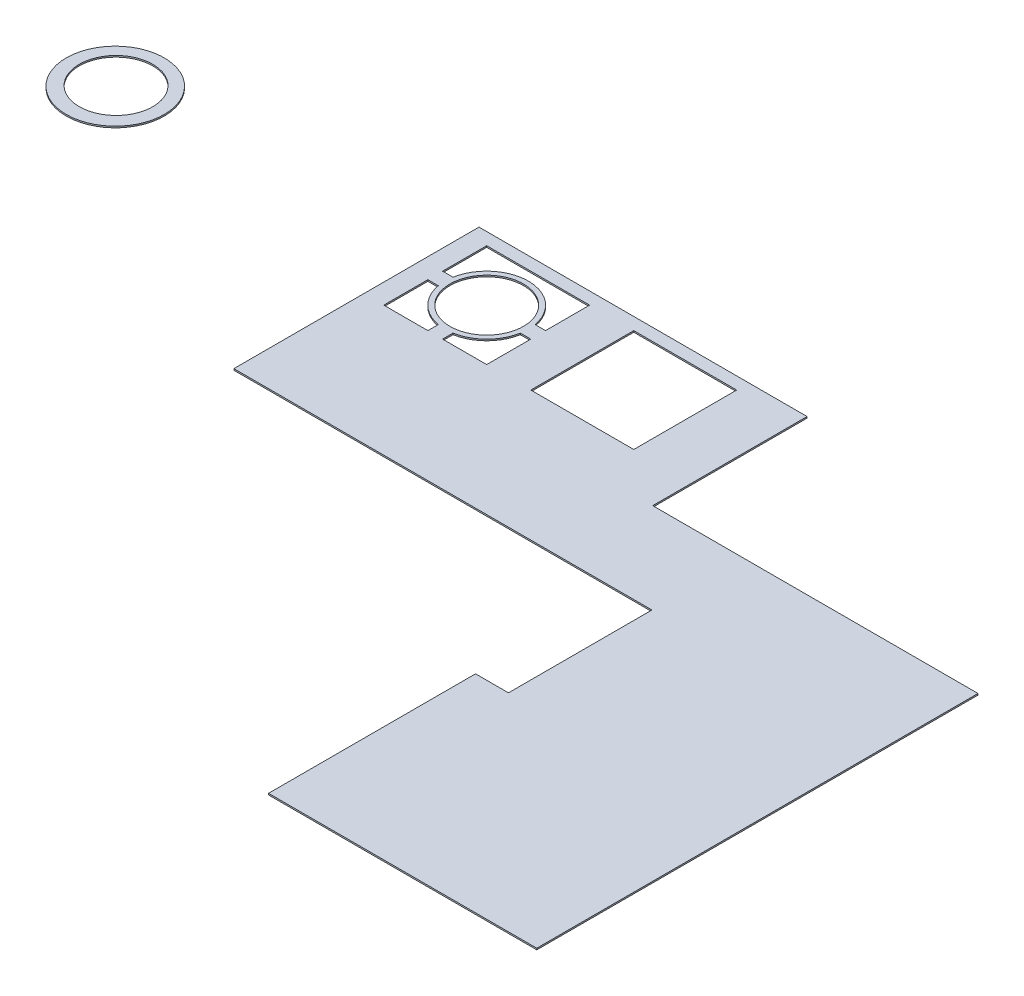
ISO-10303-21;
HEADER;
FILE_DESCRIPTION(('STEP AP214'),'2;1');
FILE_NAME('part.step','',(''),(''),'','','');
FILE_SCHEMA(('AUTOMOTIVE_DESIGN { 1 0 10303 214 1 1 1 1 }'));
ENDSEC;
DATA;
#1=APPLICATION_CONTEXT('core data for automotive mechanical design processes');
#2=APPLICATION_PROTOCOL_DEFINITION('international standard','automotive_design',2000,#1);
#3=PRODUCT_CONTEXT('',#1,'mechanical');
#4=PRODUCT('Part','Part','',(#3));
#5=PRODUCT_RELATED_PRODUCT_CATEGORY('part','',(#4));
#6=PRODUCT_DEFINITION_FORMATION('','',#4);
#7=PRODUCT_DEFINITION_CONTEXT('part definition',#1,'design');
#8=PRODUCT_DEFINITION('design','',#6,#7);
#9=PRODUCT_DEFINITION_SHAPE('','',#8);
#10=(LENGTH_UNIT() NAMED_UNIT(*) SI_UNIT(.MILLI.,.METRE.));
#11=(NAMED_UNIT(*) PLANE_ANGLE_UNIT() SI_UNIT($,.RADIAN.));
#12=(NAMED_UNIT(*) SI_UNIT($,.STERADIAN.) SOLID_ANGLE_UNIT());
#13=UNCERTAINTY_MEASURE_WITH_UNIT(LENGTH_MEASURE(1.E-05),#10,'distance_accuracy_value','');
#14=(GEOMETRIC_REPRESENTATION_CONTEXT(3) GLOBAL_UNCERTAINTY_ASSIGNED_CONTEXT((#13)) GLOBAL_UNIT_ASSIGNED_CONTEXT((#10,
#11,#12)) REPRESENTATION_CONTEXT('',''));
#15=CARTESIAN_POINT('',(0.,0.,0.));
#16=DIRECTION('',(0.,0.,1.));
#17=DIRECTION('',(1.,0.,0.));
#18=AXIS2_PLACEMENT_3D('',#15,#16,#17);
#19=CARTESIAN_POINT('',(-6.2,0.,-3.78));
#20=DIRECTION('',(0.,1.,0.));
#21=DIRECTION('',(0.,0.,1.));
#22=AXIS2_PLACEMENT_3D('',#19,#20,#21);
#23=CYLINDRICAL_SURFACE('',#22,1.);
#24=CARTESIAN_POINT('',(-6.2,0.,-3.78));
#25=DIRECTION('',(0.,1.,0.));
#26=DIRECTION('',(0.,0.,1.));
#27=AXIS2_PLACEMENT_3D('',#24,#25,#26);
#28=CIRCLE('',#27,1.);
#29=CARTESIAN_POINT('',(-6.2,0.,-2.78));
#30=VERTEX_POINT('',#29);
#31=EDGE_CURVE('E11',#30,#30,#28,.T.);
#32=ORIENTED_EDGE('',*,*,#31,.T.);
#33=EDGE_LOOP('',(#32));
#34=FACE_BOUND('',#33,.T.);
#35=CARTESIAN_POINT('',(-6.2,0.03,-3.78));
#36=DIRECTION('',(0.,1.,0.));
#37=DIRECTION('',(0.,0.,1.));
#38=AXIS2_PLACEMENT_3D('',#35,#36,#37);
#39=CIRCLE('',#38,1.);
#40=CARTESIAN_POINT('',(-6.2,0.03,-2.78));
#41=VERTEX_POINT('',#40);
#42=EDGE_CURVE('E54',#41,#41,#39,.T.);
#43=ORIENTED_EDGE('',*,*,#42,.F.);
#44=EDGE_LOOP('',(#43));
#45=FACE_BOUND('',#44,.T.);
#46=ADVANCED_FACE('F51',(#34,#45),#23,.T.);
#47=CARTESIAN_POINT('',(-6.2,0.,-3.78));
#48=DIRECTION('',(0.,1.,0.));
#49=DIRECTION('',(0.,0.,1.));
#50=AXIS2_PLACEMENT_3D('',#47,#48,#49);
#51=PLANE('',#50);
#52=CARTESIAN_POINT('',(-6.204,0.,-3.80000000000001));
#53=DIRECTION('',(0.,1.,0.));
#54=DIRECTION('',(0.,0.,1.));
#55=AXIS2_PLACEMENT_3D('',#52,#53,#54);
#56=CIRCLE('',#55,0.750000000000001);
#57=CARTESIAN_POINT('',(-6.204,0.,-3.05000000000001));
#58=VERTEX_POINT('',#57);
#59=EDGE_CURVE('E61',#58,#58,#56,.T.);
#60=ORIENTED_EDGE('',*,*,#59,.T.);
#61=EDGE_LOOP('',(#60));
#62=FACE_BOUND('',#61,.T.);
#63=ORIENTED_EDGE('',*,*,#31,.F.);
#64=EDGE_LOOP('',(#63));
#65=FACE_BOUND('',#64,.T.);
#66=ADVANCED_FACE('F69',(#62,#65),#51,.F.);
#67=CARTESIAN_POINT('',(-6.2,0.03,-3.78));
#68=DIRECTION('',(0.,1.,0.));
#69=DIRECTION('',(0.,0.,1.));
#70=AXIS2_PLACEMENT_3D('',#67,#68,#69);
#71=PLANE('',#70);
#72=CARTESIAN_POINT('',(-6.204,0.03,-3.80000000000001));
#73=DIRECTION('',(0.,1.,0.));
#74=DIRECTION('',(0.,0.,1.));
#75=AXIS2_PLACEMENT_3D('',#72,#73,#74);
#76=CIRCLE('',#75,0.750000000000001);
#77=CARTESIAN_POINT('',(-6.204,0.03,-3.05000000000001));
#78=VERTEX_POINT('',#77);
#79=EDGE_CURVE('E63',#78,#78,#76,.T.);
#80=ORIENTED_EDGE('',*,*,#79,.F.);
#81=EDGE_LOOP('',(#80));
#82=FACE_BOUND('',#81,.T.);
#83=ORIENTED_EDGE('',*,*,#42,.T.);
#84=EDGE_LOOP('',(#83));
#85=FACE_BOUND('',#84,.T.);
#86=ADVANCED_FACE('F75',(#82,#85),#71,.T.);
#87=CARTESIAN_POINT('',(-6.204,0.,-3.80000000000001));
#88=DIRECTION('',(0.,1.,0.));
#89=DIRECTION('',(0.,0.,1.));
#90=AXIS2_PLACEMENT_3D('',#87,#88,#89);
#91=CYLINDRICAL_SURFACE('',#90,0.750000000000001);
#92=ORIENTED_EDGE('',*,*,#59,.F.);
#93=EDGE_LOOP('',(#92));
#94=FACE_BOUND('',#93,.T.);
#95=ORIENTED_EDGE('',*,*,#79,.T.);
#96=EDGE_LOOP('',(#95));
#97=FACE_BOUND('',#96,.T.);
#98=ADVANCED_FACE('F72',(#94,#97),#91,.F.);
#99=CLOSED_SHELL('',(#46,#66,#86,#98));
#100=MANIFOLD_SOLID_BREP('B2',#99);
#101=CARTESIAN_POINT('',(0.407,0.03,-4.75));
#102=DIRECTION('',(1.,0.,0.));
#103=DIRECTION('',(0.,0.,-1.));
#104=AXIS2_PLACEMENT_3D('',#101,#102,#103);
#105=PLANE('',#104);
#106=DIRECTION('',(0.,1.,0.));
#107=VECTOR('',#106,1.);
#108=CARTESIAN_POINT('',(0.407,-2.83196045170126,-3.85));
#109=LINE('',#108,#107);
#110=CARTESIAN_POINT('',(0.407,0.,-3.85));
#111=VERTEX_POINT('',#110);
#112=CARTESIAN_POINT('',(0.407,0.03,-3.85));
#113=VERTEX_POINT('',#112);
#114=EDGE_CURVE('E394',#111,#113,#109,.T.);
#115=ORIENTED_EDGE('',*,*,#114,.F.);
#116=DIRECTION('',(0.,0.,1.));
#117=VECTOR('',#116,1.);
#118=CARTESIAN_POINT('',(0.407,0.,-4.75));
#119=LINE('',#118,#117);
#120=CARTESIAN_POINT('',(0.407,0.,-4.75));
#121=VERTEX_POINT('',#120);
#122=EDGE_CURVE('E459',#121,#111,#119,.T.);
#123=ORIENTED_EDGE('',*,*,#122,.F.);
#124=DIRECTION('',(0.,-1.,0.));
#125=VECTOR('',#124,1.);
#126=CARTESIAN_POINT('',(0.407,0.03,-4.75));
#127=LINE('',#126,#125);
#128=CARTESIAN_POINT('',(0.407,0.03,-4.75));
#129=VERTEX_POINT('',#128);
#130=EDGE_CURVE('E458',#129,#121,#127,.T.);
#131=ORIENTED_EDGE('',*,*,#130,.F.);
#132=DIRECTION('',(0.,0.,1.));
#133=VECTOR('',#132,1.);
#134=CARTESIAN_POINT('',(0.407,0.03,-4.75));
#135=LINE('',#134,#133);
#136=EDGE_CURVE('E144',#129,#113,#135,.T.);
#137=ORIENTED_EDGE('',*,*,#136,.T.);
#138=EDGE_LOOP('',(#115,#123,#131,#137));
#139=FACE_BOUND('',#138,.T.);
#140=ADVANCED_FACE('F121',(#139),#105,.T.);
#141=CARTESIAN_POINT('',(0.407,0.03,-2.65));
#142=DIRECTION('',(0.,0.,-1.));
#143=DIRECTION('',(-1.,0.,0.));
#144=AXIS2_PLACEMENT_3D('',#141,#142,#143);
#145=PLANE('',#144);
#146=DIRECTION('',(0.,1.,0.));
#147=VECTOR('',#146,1.);
#148=CARTESIAN_POINT('',(1.307,-2.83196045170126,-2.65));
#149=LINE('',#148,#147);
#150=CARTESIAN_POINT('',(1.307,0.,-2.65));
#151=VERTEX_POINT('',#150);
#152=CARTESIAN_POINT('',(1.307,0.03,-2.65));
#153=VERTEX_POINT('',#152);
#154=EDGE_CURVE('E382',#151,#153,#149,.T.);
#155=ORIENTED_EDGE('',*,*,#154,.F.);
#156=DIRECTION('',(1.,0.,0.));
#157=VECTOR('',#156,1.);
#158=CARTESIAN_POINT('',(0.407,0.,-2.65));
#159=LINE('',#158,#157);
#160=CARTESIAN_POINT('',(0.407,0.,-2.65));
#161=VERTEX_POINT('',#160);
#162=EDGE_CURVE('E463',#161,#151,#159,.T.);
#163=ORIENTED_EDGE('',*,*,#162,.F.);
#164=DIRECTION('',(0.,-1.,0.));
#165=VECTOR('',#164,1.);
#166=CARTESIAN_POINT('',(0.407,0.03,-2.65));
#167=LINE('',#166,#165);
#168=CARTESIAN_POINT('',(0.407,0.03,-2.65));
#169=VERTEX_POINT('',#168);
#170=EDGE_CURVE('E481',#169,#161,#167,.T.);
#171=ORIENTED_EDGE('',*,*,#170,.F.);
#172=DIRECTION('',(1.,0.,0.));
#173=VECTOR('',#172,1.);
#174=CARTESIAN_POINT('',(0.407,0.03,-2.65));
#175=LINE('',#174,#173);
#176=EDGE_CURVE('E451',#169,#153,#175,.T.);
#177=ORIENTED_EDGE('',*,*,#176,.T.);
#178=EDGE_LOOP('',(#155,#163,#171,#177));
#179=FACE_BOUND('',#178,.T.);
#180=ADVANCED_FACE('F611',(#179),#145,.T.);
#181=CARTESIAN_POINT('',(2.507,0.03,-4.75));
#182=DIRECTION('',(-1.,0.,0.));
#183=DIRECTION('',(0.,0.,1.));
#184=AXIS2_PLACEMENT_3D('',#181,#182,#183);
#185=PLANE('',#184);
#186=DIRECTION('',(0.,1.,0.));
#187=VECTOR('',#186,1.);
#188=CARTESIAN_POINT('',(2.507,-2.83196045170126,-3.55));
#189=LINE('',#188,#187);
#190=CARTESIAN_POINT('',(2.507,0.,-3.55));
#191=VERTEX_POINT('',#190);
#192=CARTESIAN_POINT('',(2.507,0.03,-3.55));
#193=VERTEX_POINT('',#192);
#194=EDGE_CURVE('E352',#191,#193,#189,.T.);
#195=ORIENTED_EDGE('',*,*,#194,.F.);
#196=DIRECTION('',(0.,0.,-1.));
#197=VECTOR('',#196,1.);
#198=CARTESIAN_POINT('',(2.507,0.,-4.75));
#199=LINE('',#198,#197);
#200=CARTESIAN_POINT('',(2.507,0.,-2.65));
#201=VERTEX_POINT('',#200);
#202=EDGE_CURVE('E467',#201,#191,#199,.T.);
#203=ORIENTED_EDGE('',*,*,#202,.F.);
#204=DIRECTION('',(0.,-1.,0.));
#205=VECTOR('',#204,1.);
#206=CARTESIAN_POINT('',(2.507,0.03,-2.65));
#207=LINE('',#206,#205);
#208=CARTESIAN_POINT('',(2.507,0.03,-2.65));
#209=VERTEX_POINT('',#208);
#210=EDGE_CURVE('E478',#209,#201,#207,.T.);
#211=ORIENTED_EDGE('',*,*,#210,.F.);
#212=DIRECTION('',(0.,0.,-1.));
#213=VECTOR('',#212,1.);
#214=CARTESIAN_POINT('',(2.507,0.03,-4.75));
#215=LINE('',#214,#213);
#216=EDGE_CURVE('E454',#209,#193,#215,.T.);
#217=ORIENTED_EDGE('',*,*,#216,.T.);
#218=EDGE_LOOP('',(#195,#203,#211,#217));
#219=FACE_BOUND('',#218,.T.);
#220=ADVANCED_FACE('F617',(#219),#185,.T.);
#221=CARTESIAN_POINT('',(0.,0.03,0.));
#222=DIRECTION('',(0.,-1.,0.));
#223=DIRECTION('',(0.,0.,-1.));
#224=AXIS2_PLACEMENT_3D('',#221,#222,#223);
#225=PLANE('',#224);
#226=CARTESIAN_POINT('',(1.457,0.03,-3.7));
#227=DIRECTION('',(0.,1.,0.));
#228=DIRECTION('',(0.,0.,1.));
#229=AXIS2_PLACEMENT_3D('',#226,#227,#228);
#230=CIRCLE('',#229,0.75);
#231=CARTESIAN_POINT('',(1.457,0.03,-2.95));
#232=VERTEX_POINT('',#231);
#233=EDGE_CURVE('E341',#232,#232,#230,.T.);
#234=ORIENTED_EDGE('',*,*,#233,.F.);
#235=EDGE_LOOP('',(#234));
#236=FACE_BOUND('',#235,.T.);
#237=CARTESIAN_POINT('',(0.407,0.03,-3.55));
#238=VERTEX_POINT('',#237);
#239=EDGE_CURVE('E450',#238,#169,#135,.T.);
#240=ORIENTED_EDGE('',*,*,#239,.F.);
#241=DIRECTION('',(1.,0.,0.));
#242=VECTOR('',#241,1.);
#243=CARTESIAN_POINT('',(0.407,0.03,-3.55));
#244=LINE('',#243,#242);
#245=CARTESIAN_POINT('',(0.620339973465924,0.03,-3.55));
#246=VERTEX_POINT('',#245);
#247=EDGE_CURVE('E363',#238,#246,#244,.T.);
#248=ORIENTED_EDGE('',*,*,#247,.T.);
#249=CARTESIAN_POINT('',(1.457,0.03,-3.7));
#250=DIRECTION('',(0.,1.,0.));
#251=DIRECTION('',(0.,0.,1.));
#252=AXIS2_PLACEMENT_3D('',#249,#250,#251);
#253=CIRCLE('',#252,0.850000000000001);
#254=CARTESIAN_POINT('',(1.307,0.03,-2.86333997346592));
#255=VERTEX_POINT('',#254);
#256=EDGE_CURVE('E355',#246,#255,#253,.T.);
#257=ORIENTED_EDGE('',*,*,#256,.T.);
#258=DIRECTION('',(0.,0.,1.));
#259=VECTOR('',#258,1.);
#260=CARTESIAN_POINT('',(1.307,0.03,-2.65));
#261=LINE('',#260,#259);
#262=EDGE_CURVE('E349',#255,#153,#261,.T.);
#263=ORIENTED_EDGE('',*,*,#262,.T.);
#264=ORIENTED_EDGE('',*,*,#176,.F.);
#265=EDGE_LOOP('',(#240,#248,#257,#263,#264));
#266=FACE_BOUND('',#265,.T.);
#267=CARTESIAN_POINT('',(1.607,0.03,-2.65));
#268=VERTEX_POINT('',#267);
#269=EDGE_CURVE('E347',#268,#209,#175,.T.);
#270=ORIENTED_EDGE('',*,*,#269,.F.);
#271=DIRECTION('',(0.,0.,-1.));
#272=VECTOR('',#271,1.);
#273=CARTESIAN_POINT('',(1.607,0.03,-2.65));
#274=LINE('',#273,#272);
#275=CARTESIAN_POINT('',(1.607,0.03,-2.86333997346592));
#276=VERTEX_POINT('',#275);
#277=EDGE_CURVE('E325',#268,#276,#274,.T.);
#278=ORIENTED_EDGE('',*,*,#277,.T.);
#279=CARTESIAN_POINT('',(1.457,0.03,-3.7));
#280=DIRECTION('',(0.,1.,0.));
#281=DIRECTION('',(0.,0.,1.));
#282=AXIS2_PLACEMENT_3D('',#279,#280,#281);
#283=CIRCLE('',#282,0.850000000000001);
#284=CARTESIAN_POINT('',(2.29366002653408,0.03,-3.55));
#285=VERTEX_POINT('',#284);
#286=EDGE_CURVE('E333',#276,#285,#283,.T.);
#287=ORIENTED_EDGE('',*,*,#286,.T.);
#288=DIRECTION('',(1.,0.,0.));
#289=VECTOR('',#288,1.);
#290=CARTESIAN_POINT('',(2.507,0.03,-3.55));
#291=LINE('',#290,#289);
#292=EDGE_CURVE('E340',#285,#193,#291,.T.);
#293=ORIENTED_EDGE('',*,*,#292,.T.);
#294=ORIENTED_EDGE('',*,*,#216,.F.);
#295=EDGE_LOOP('',(#270,#278,#287,#293,#294));
#296=FACE_BOUND('',#295,.T.);
#297=ORIENTED_EDGE('',*,*,#136,.F.);
#298=DIRECTION('',(-1.,0.,0.));
#299=VECTOR('',#298,1.);
#300=CARTESIAN_POINT('',(0.407,0.03,-4.75));
#301=LINE('',#300,#299);
#302=CARTESIAN_POINT('',(2.507,0.03,-4.75));
#303=VERTEX_POINT('',#302);
#304=EDGE_CURVE('E456',#303,#129,#301,.T.);
#305=ORIENTED_EDGE('',*,*,#304,.F.);
#306=CARTESIAN_POINT('',(2.507,0.03,-3.85));
#307=VERTEX_POINT('',#306);
#308=EDGE_CURVE('E453',#307,#303,#215,.T.);
#309=ORIENTED_EDGE('',*,*,#308,.F.);
#310=DIRECTION('',(-1.,0.,0.));
#311=VECTOR('',#310,1.);
#312=CARTESIAN_POINT('',(2.507,0.03,-3.85));
#313=LINE('',#312,#311);
#314=CARTESIAN_POINT('',(2.29366002653408,0.03,-3.85));
#315=VERTEX_POINT('',#314);
#316=EDGE_CURVE('E372',#307,#315,#313,.T.);
#317=ORIENTED_EDGE('',*,*,#316,.T.);
#318=CARTESIAN_POINT('',(1.457,0.03,-3.7));
#319=DIRECTION('',(0.,1.,0.));
#320=DIRECTION('',(0.,0.,1.));
#321=AXIS2_PLACEMENT_3D('',#318,#319,#320);
#322=CIRCLE('',#321,0.850000000000001);
#323=CARTESIAN_POINT('',(0.620339973465924,0.03,-3.85));
#324=VERTEX_POINT('',#323);
#325=EDGE_CURVE('E369',#315,#324,#322,.T.);
#326=ORIENTED_EDGE('',*,*,#325,.T.);
#327=DIRECTION('',(-1.,0.,0.));
#328=VECTOR('',#327,1.);
#329=CARTESIAN_POINT('',(0.407,0.03,-3.85));
#330=LINE('',#329,#328);
#331=EDGE_CURVE('E366',#324,#113,#330,.T.);
#332=ORIENTED_EDGE('',*,*,#331,.T.);
#333=EDGE_LOOP('',(#297,#305,#309,#317,#326,#332));
#334=FACE_BOUND('',#333,.T.);
#335=DIRECTION('',(1.,0.,0.));
#336=VECTOR('',#335,1.);
#337=CARTESIAN_POINT('',(8.528,0.03,0.));
#338=LINE('',#337,#336);
#339=CARTESIAN_POINT('',(0.,0.03,0.));
#340=VERTEX_POINT('',#339);
#341=CARTESIAN_POINT('',(8.528,0.03,0.));
#342=VERTEX_POINT('',#341);
#343=EDGE_CURVE('E485',#340,#342,#338,.T.);
#344=ORIENTED_EDGE('',*,*,#343,.T.);
#345=DIRECTION('',(0.,0.,1.));
#346=VECTOR('',#345,1.);
#347=CARTESIAN_POINT('',(8.528,0.03,2.927));
#348=LINE('',#347,#346);
#349=CARTESIAN_POINT('',(8.528,0.03,2.927));
#350=VERTEX_POINT('',#349);
#351=EDGE_CURVE('E488',#342,#350,#348,.T.);
#352=ORIENTED_EDGE('',*,*,#351,.T.);
#353=DIRECTION('',(-1.,0.,0.));
#354=VECTOR('',#353,1.);
#355=CARTESIAN_POINT('',(7.856,0.03,2.927));
#356=LINE('',#355,#354);
#357=CARTESIAN_POINT('',(7.856,0.03,2.927));
#358=VERTEX_POINT('',#357);
#359=EDGE_CURVE('E491',#350,#358,#356,.T.);
#360=ORIENTED_EDGE('',*,*,#359,.T.);
#361=DIRECTION('',(0.,0.,1.));
#362=VECTOR('',#361,1.);
#363=CARTESIAN_POINT('',(7.856,0.03,7.149));
#364=LINE('',#363,#362);
#365=CARTESIAN_POINT('',(7.856,0.03,7.149));
#366=VERTEX_POINT('',#365);
#367=EDGE_CURVE('E493',#358,#366,#364,.T.);
#368=ORIENTED_EDGE('',*,*,#367,.T.);
#369=DIRECTION('',(1.,0.,0.));
#370=VECTOR('',#369,1.);
#371=CARTESIAN_POINT('',(13.328,0.03,7.149));
#372=LINE('',#371,#370);
#373=CARTESIAN_POINT('',(13.328,0.03,7.149));
#374=VERTEX_POINT('',#373);
#375=EDGE_CURVE('E495',#366,#374,#372,.T.);
#376=ORIENTED_EDGE('',*,*,#375,.T.);
#377=DIRECTION('',(0.,0.,-1.));
#378=VECTOR('',#377,1.);
#379=CARTESIAN_POINT('',(13.328,0.03,-1.851));
#380=LINE('',#379,#378);
#381=CARTESIAN_POINT('',(13.328,0.03,-1.851));
#382=VERTEX_POINT('',#381);
#383=EDGE_CURVE('E497',#374,#382,#380,.T.);
#384=ORIENTED_EDGE('',*,*,#383,.T.);
#385=DIRECTION('',(-1.,0.,0.));
#386=VECTOR('',#385,1.);
#387=CARTESIAN_POINT('',(6.692,0.03,-1.851));
#388=LINE('',#387,#386);
#389=CARTESIAN_POINT('',(6.692,0.03,-1.851));
#390=VERTEX_POINT('',#389);
#391=EDGE_CURVE('E499',#382,#390,#388,.T.);
#392=ORIENTED_EDGE('',*,*,#391,.T.);
#393=DIRECTION('',(0.,0.,-1.));
#394=VECTOR('',#393,1.);
#395=CARTESIAN_POINT('',(6.692,0.03,-5.));
#396=LINE('',#395,#394);
#397=CARTESIAN_POINT('',(6.692,0.03,-5.));
#398=VERTEX_POINT('',#397);
#399=EDGE_CURVE('E501',#390,#398,#396,.T.);
#400=ORIENTED_EDGE('',*,*,#399,.T.);
#401=DIRECTION('',(-1.,0.,0.));
#402=VECTOR('',#401,1.);
#403=CARTESIAN_POINT('',(0.,0.03,-5.));
#404=LINE('',#403,#402);
#405=CARTESIAN_POINT('',(0.,0.03,-5.));
#406=VERTEX_POINT('',#405);
#407=EDGE_CURVE('E503',#398,#406,#404,.T.);
#408=ORIENTED_EDGE('',*,*,#407,.T.);
#409=DIRECTION('',(0.,0.,1.));
#410=VECTOR('',#409,1.);
#411=CARTESIAN_POINT('',(0.,0.03,0.));
#412=LINE('',#411,#410);
#413=EDGE_CURVE('E505',#406,#340,#412,.T.);
#414=ORIENTED_EDGE('',*,*,#413,.T.);
#415=EDGE_LOOP('',(#344,#352,#360,#368,#376,#384,#392,#400,#408,#414));
#416=FACE_BOUND('',#415,.T.);
#417=DIRECTION('',(0.,0.,1.));
#418=VECTOR('',#417,1.);
#419=CARTESIAN_POINT('',(3.407,0.03,-4.75));
#420=LINE('',#419,#418);
#421=CARTESIAN_POINT('',(3.407,0.03,-4.75));
#422=VERTEX_POINT('',#421);
#423=CARTESIAN_POINT('',(3.407,0.03,-2.65));
#424=VERTEX_POINT('',#423);
#425=EDGE_CURVE('E418',#422,#424,#420,.T.);
#426=ORIENTED_EDGE('',*,*,#425,.F.);
#427=DIRECTION('',(-1.,0.,0.));
#428=VECTOR('',#427,1.);
#429=CARTESIAN_POINT('',(3.407,0.03,-4.75));
#430=LINE('',#429,#428);
#431=CARTESIAN_POINT('',(5.507,0.03,-4.75));
#432=VERTEX_POINT('',#431);
#433=EDGE_CURVE('E426',#432,#422,#430,.T.);
#434=ORIENTED_EDGE('',*,*,#433,.F.);
#435=DIRECTION('',(0.,0.,-1.));
#436=VECTOR('',#435,1.);
#437=CARTESIAN_POINT('',(5.507,0.03,-4.75));
#438=LINE('',#437,#436);
#439=CARTESIAN_POINT('',(5.507,0.03,-2.65));
#440=VERTEX_POINT('',#439);
#441=EDGE_CURVE('E423',#440,#432,#438,.T.);
#442=ORIENTED_EDGE('',*,*,#441,.F.);
#443=DIRECTION('',(1.,0.,0.));
#444=VECTOR('',#443,1.);
#445=CARTESIAN_POINT('',(3.407,0.03,-2.65));
#446=LINE('',#445,#444);
#447=EDGE_CURVE('E420',#424,#440,#446,.T.);
#448=ORIENTED_EDGE('',*,*,#447,.F.);
#449=EDGE_LOOP('',(#426,#434,#442,#448));
#450=FACE_BOUND('',#449,.T.);
#451=ADVANCED_FACE('F344',(#236,#266,#296,#334,#416,#450),#225,.F.);
#452=CARTESIAN_POINT('',(0.,0.,0.));
#453=DIRECTION('',(0.,-1.,0.));
#454=DIRECTION('',(0.,0.,-1.));
#455=AXIS2_PLACEMENT_3D('',#452,#453,#454);
#456=PLANE('',#455);
#457=CARTESIAN_POINT('',(1.457,0.,-3.7));
#458=DIRECTION('',(0.,1.,0.));
#459=DIRECTION('',(0.,0.,1.));
#460=AXIS2_PLACEMENT_3D('',#457,#458,#459);
#461=CIRCLE('',#460,0.75);
#462=CARTESIAN_POINT('',(1.457,0.,-2.95));
#463=VERTEX_POINT('',#462);
#464=EDGE_CURVE('E358',#463,#463,#461,.T.);
#465=ORIENTED_EDGE('',*,*,#464,.T.);
#466=EDGE_LOOP('',(#465));
#467=FACE_BOUND('',#466,.T.);
#468=DIRECTION('',(1.,0.,0.));
#469=VECTOR('',#468,1.);
#470=CARTESIAN_POINT('',(0.407,0.,-3.55));
#471=LINE('',#470,#469);
#472=CARTESIAN_POINT('',(0.407,0.,-3.55));
#473=VERTEX_POINT('',#472);
#474=CARTESIAN_POINT('',(0.620339973465924,0.,-3.55));
#475=VERTEX_POINT('',#474);
#476=EDGE_CURVE('E388',#473,#475,#471,.T.);
#477=ORIENTED_EDGE('',*,*,#476,.F.);
#478=EDGE_CURVE('E448',#473,#161,#119,.T.);
#479=ORIENTED_EDGE('',*,*,#478,.T.);
#480=ORIENTED_EDGE('',*,*,#162,.T.);
#481=DIRECTION('',(0.,0.,1.));
#482=VECTOR('',#481,1.);
#483=CARTESIAN_POINT('',(1.307,0.,-2.65));
#484=LINE('',#483,#482);
#485=CARTESIAN_POINT('',(1.307,0.,-2.86333997346592));
#486=VERTEX_POINT('',#485);
#487=EDGE_CURVE('E379',#486,#151,#484,.T.);
#488=ORIENTED_EDGE('',*,*,#487,.F.);
#489=CARTESIAN_POINT('',(1.457,0.,-3.7));
#490=DIRECTION('',(0.,-1.,0.));
#491=DIRECTION('',(0.,0.,-1.));
#492=AXIS2_PLACEMENT_3D('',#489,#490,#491);
#493=CIRCLE('',#492,0.850000000000001);
#494=EDGE_CURVE('E384',#475,#486,#493,.F.);
#495=ORIENTED_EDGE('',*,*,#494,.F.);
#496=EDGE_LOOP('',(#477,#479,#480,#488,#495));
#497=FACE_BOUND('',#496,.T.);
#498=DIRECTION('',(0.,0.,-1.));
#499=VECTOR('',#498,1.);
#500=CARTESIAN_POINT('',(1.607,0.,-2.65));
#501=LINE('',#500,#499);
#502=CARTESIAN_POINT('',(1.607,0.,-2.65));
#503=VERTEX_POINT('',#502);
#504=CARTESIAN_POINT('',(1.607,0.,-2.86333997346592));
#505=VERTEX_POINT('',#504);
#506=EDGE_CURVE('E327',#503,#505,#501,.T.);
#507=ORIENTED_EDGE('',*,*,#506,.F.);
#508=EDGE_CURVE('E462',#503,#201,#159,.T.);
#509=ORIENTED_EDGE('',*,*,#508,.T.);
#510=ORIENTED_EDGE('',*,*,#202,.T.);
#511=DIRECTION('',(1.,0.,0.));
#512=VECTOR('',#511,1.);
#513=CARTESIAN_POINT('',(2.507,0.,-3.55));
#514=LINE('',#513,#512);
#515=CARTESIAN_POINT('',(2.29366002653408,0.,-3.55));
#516=VERTEX_POINT('',#515);
#517=EDGE_CURVE('E348',#516,#191,#514,.T.);
#518=ORIENTED_EDGE('',*,*,#517,.F.);
#519=CARTESIAN_POINT('',(1.457,0.,-3.7));
#520=DIRECTION('',(0.,-1.,0.));
#521=DIRECTION('',(0.,0.,-1.));
#522=AXIS2_PLACEMENT_3D('',#519,#520,#521);
#523=CIRCLE('',#522,0.850000000000001);
#524=EDGE_CURVE('E330',#505,#516,#523,.F.);
#525=ORIENTED_EDGE('',*,*,#524,.F.);
#526=EDGE_LOOP('',(#507,#509,#510,#518,#525));
#527=FACE_BOUND('',#526,.T.);
#528=DIRECTION('',(1.,0.,0.));
#529=VECTOR('',#528,1.);
#530=CARTESIAN_POINT('',(8.528,0.,0.));
#531=LINE('',#530,#529);
#532=CARTESIAN_POINT('',(0.,0.,0.));
#533=VERTEX_POINT('',#532);
#534=CARTESIAN_POINT('',(8.528,0.,0.));
#535=VERTEX_POINT('',#534);
#536=EDGE_CURVE('E484',#533,#535,#531,.T.);
#537=ORIENTED_EDGE('',*,*,#536,.F.);
#538=DIRECTION('',(0.,0.,1.));
#539=VECTOR('',#538,1.);
#540=CARTESIAN_POINT('',(0.,0.,0.));
#541=LINE('',#540,#539);
#542=CARTESIAN_POINT('',(0.,0.,-5.));
#543=VERTEX_POINT('',#542);
#544=EDGE_CURVE('E489',#543,#533,#541,.T.);
#545=ORIENTED_EDGE('',*,*,#544,.F.);
#546=DIRECTION('',(-1.,0.,0.));
#547=VECTOR('',#546,1.);
#548=CARTESIAN_POINT('',(0.,0.,-5.));
#549=LINE('',#548,#547);
#550=CARTESIAN_POINT('',(6.692,0.,-5.));
#551=VERTEX_POINT('',#550);
#552=EDGE_CURVE('E524',#551,#543,#549,.T.);
#553=ORIENTED_EDGE('',*,*,#552,.F.);
#554=DIRECTION('',(0.,0.,-1.));
#555=VECTOR('',#554,1.);
#556=CARTESIAN_POINT('',(6.692,0.,-5.));
#557=LINE('',#556,#555);
#558=CARTESIAN_POINT('',(6.692,0.,-1.851));
#559=VERTEX_POINT('',#558);
#560=EDGE_CURVE('E522',#559,#551,#557,.T.);
#561=ORIENTED_EDGE('',*,*,#560,.F.);
#562=DIRECTION('',(-1.,0.,0.));
#563=VECTOR('',#562,1.);
#564=CARTESIAN_POINT('',(6.692,0.,-1.851));
#565=LINE('',#564,#563);
#566=CARTESIAN_POINT('',(13.328,0.,-1.851));
#567=VERTEX_POINT('',#566);
#568=EDGE_CURVE('E520',#567,#559,#565,.T.);
#569=ORIENTED_EDGE('',*,*,#568,.F.);
#570=DIRECTION('',(0.,0.,-1.));
#571=VECTOR('',#570,1.);
#572=CARTESIAN_POINT('',(13.328,0.,-1.851));
#573=LINE('',#572,#571);
#574=CARTESIAN_POINT('',(13.328,0.,7.149));
#575=VERTEX_POINT('',#574);
#576=EDGE_CURVE('E518',#575,#567,#573,.T.);
#577=ORIENTED_EDGE('',*,*,#576,.F.);
#578=DIRECTION('',(1.,0.,0.));
#579=VECTOR('',#578,1.);
#580=CARTESIAN_POINT('',(13.328,0.,7.149));
#581=LINE('',#580,#579);
#582=CARTESIAN_POINT('',(7.856,0.,7.149));
#583=VERTEX_POINT('',#582);
#584=EDGE_CURVE('E516',#583,#575,#581,.T.);
#585=ORIENTED_EDGE('',*,*,#584,.F.);
#586=DIRECTION('',(0.,0.,1.));
#587=VECTOR('',#586,1.);
#588=CARTESIAN_POINT('',(7.856,0.,7.149));
#589=LINE('',#588,#587);
#590=CARTESIAN_POINT('',(7.856,0.,2.927));
#591=VERTEX_POINT('',#590);
#592=EDGE_CURVE('E514',#591,#583,#589,.T.);
#593=ORIENTED_EDGE('',*,*,#592,.F.);
#594=DIRECTION('',(-1.,0.,0.));
#595=VECTOR('',#594,1.);
#596=CARTESIAN_POINT('',(7.856,0.,2.927));
#597=LINE('',#596,#595);
#598=CARTESIAN_POINT('',(8.528,0.,2.927));
#599=VERTEX_POINT('',#598);
#600=EDGE_CURVE('E512',#599,#591,#597,.T.);
#601=ORIENTED_EDGE('',*,*,#600,.F.);
#602=DIRECTION('',(0.,0.,1.));
#603=VECTOR('',#602,1.);
#604=CARTESIAN_POINT('',(8.528,0.,2.927));
#605=LINE('',#604,#603);
#606=EDGE_CURVE('E510',#535,#599,#605,.T.);
#607=ORIENTED_EDGE('',*,*,#606,.F.);
#608=EDGE_LOOP('',(#537,#545,#553,#561,#569,#577,#585,#593,#601,#607));
#609=FACE_BOUND('',#608,.T.);
#610=DIRECTION('',(-1.,0.,0.));
#611=VECTOR('',#610,1.);
#612=CARTESIAN_POINT('',(0.407,0.,-4.75));
#613=LINE('',#612,#611);
#614=CARTESIAN_POINT('',(2.507,0.,-4.75));
#615=VERTEX_POINT('',#614);
#616=EDGE_CURVE('E470',#615,#121,#613,.T.);
#617=ORIENTED_EDGE('',*,*,#616,.T.);
#618=ORIENTED_EDGE('',*,*,#122,.T.);
#619=DIRECTION('',(-1.,0.,0.));
#620=VECTOR('',#619,1.);
#621=CARTESIAN_POINT('',(0.407,0.,-3.85));
#622=LINE('',#621,#620);
#623=CARTESIAN_POINT('',(0.620339973465924,0.,-3.85));
#624=VERTEX_POINT('',#623);
#625=EDGE_CURVE('E391',#624,#111,#622,.T.);
#626=ORIENTED_EDGE('',*,*,#625,.F.);
#627=CARTESIAN_POINT('',(1.457,0.,-3.7));
#628=DIRECTION('',(0.,-1.,0.));
#629=DIRECTION('',(0.,0.,-1.));
#630=AXIS2_PLACEMENT_3D('',#627,#628,#629);
#631=CIRCLE('',#630,0.850000000000001);
#632=CARTESIAN_POINT('',(2.29366002653408,0.,-3.85));
#633=VERTEX_POINT('',#632);
#634=EDGE_CURVE('E396',#633,#624,#631,.F.);
#635=ORIENTED_EDGE('',*,*,#634,.F.);
#636=DIRECTION('',(-1.,0.,0.));
#637=VECTOR('',#636,1.);
#638=CARTESIAN_POINT('',(2.507,0.,-3.85));
#639=LINE('',#638,#637);
#640=CARTESIAN_POINT('',(2.507,0.,-3.85));
#641=VERTEX_POINT('',#640);
#642=EDGE_CURVE('E400',#641,#633,#639,.T.);
#643=ORIENTED_EDGE('',*,*,#642,.F.);
#644=EDGE_CURVE('E466',#641,#615,#199,.T.);
#645=ORIENTED_EDGE('',*,*,#644,.T.);
#646=EDGE_LOOP('',(#617,#618,#626,#635,#643,#645));
#647=FACE_BOUND('',#646,.T.);
#648=DIRECTION('',(-1.,0.,0.));
#649=VECTOR('',#648,1.);
#650=CARTESIAN_POINT('',(3.407,0.,-4.75));
#651=LINE('',#650,#649);
#652=CARTESIAN_POINT('',(5.507,0.,-4.75));
#653=VERTEX_POINT('',#652);
#654=CARTESIAN_POINT('',(3.407,0.,-4.75));
#655=VERTEX_POINT('',#654);
#656=EDGE_CURVE('E421',#653,#655,#651,.T.);
#657=ORIENTED_EDGE('',*,*,#656,.T.);
#658=DIRECTION('',(0.,0.,1.));
#659=VECTOR('',#658,1.);
#660=CARTESIAN_POINT('',(3.407,0.,-4.75));
#661=LINE('',#660,#659);
#662=CARTESIAN_POINT('',(3.407,0.,-2.65));
#663=VERTEX_POINT('',#662);
#664=EDGE_CURVE('E417',#655,#663,#661,.T.);
#665=ORIENTED_EDGE('',*,*,#664,.T.);
#666=DIRECTION('',(1.,0.,0.));
#667=VECTOR('',#666,1.);
#668=CARTESIAN_POINT('',(3.407,0.,-2.65));
#669=LINE('',#668,#667);
#670=CARTESIAN_POINT('',(5.507,0.,-2.65));
#671=VERTEX_POINT('',#670);
#672=EDGE_CURVE('E431',#663,#671,#669,.T.);
#673=ORIENTED_EDGE('',*,*,#672,.T.);
#674=DIRECTION('',(0.,0.,-1.));
#675=VECTOR('',#674,1.);
#676=CARTESIAN_POINT('',(5.507,0.,-4.75));
#677=LINE('',#676,#675);
#678=EDGE_CURVE('E434',#671,#653,#677,.T.);
#679=ORIENTED_EDGE('',*,*,#678,.T.);
#680=EDGE_LOOP('',(#657,#665,#673,#679));
#681=FACE_BOUND('',#680,.T.);
#682=ADVANCED_FACE('F560',(#467,#497,#527,#609,#647,#681),#456,.T.);
#683=CARTESIAN_POINT('',(8.528,0.03,0.));
#684=DIRECTION('',(0.,0.,-1.));
#685=DIRECTION('',(-1.,0.,0.));
#686=AXIS2_PLACEMENT_3D('',#683,#684,#685);
#687=PLANE('',#686);
#688=ORIENTED_EDGE('',*,*,#536,.T.);
#689=DIRECTION('',(0.,-1.,0.));
#690=VECTOR('',#689,1.);
#691=CARTESIAN_POINT('',(8.528,0.03,0.));
#692=LINE('',#691,#690);
#693=EDGE_CURVE('E49',#342,#535,#692,.T.);
#694=ORIENTED_EDGE('',*,*,#693,.F.);
#695=ORIENTED_EDGE('',*,*,#343,.F.);
#696=DIRECTION('',(0.,-1.,0.));
#697=VECTOR('',#696,1.);
#698=CARTESIAN_POINT('',(0.,0.03,0.));
#699=LINE('',#698,#697);
#700=EDGE_CURVE('E507',#340,#533,#699,.T.);
#701=ORIENTED_EDGE('',*,*,#700,.T.);
#702=EDGE_LOOP('',(#688,#694,#695,#701));
#703=FACE_BOUND('',#702,.T.);
#704=ADVANCED_FACE('F123',(#703),#687,.F.);
#705=CARTESIAN_POINT('',(8.528,0.03,2.927));
#706=DIRECTION('',(1.,0.,0.));
#707=DIRECTION('',(0.,0.,-1.));
#708=AXIS2_PLACEMENT_3D('',#705,#706,#707);
#709=PLANE('',#708);
#710=ORIENTED_EDGE('',*,*,#606,.T.);
#711=DIRECTION('',(0.,-1.,0.));
#712=VECTOR('',#711,1.);
#713=CARTESIAN_POINT('',(8.528,0.03,2.927));
#714=LINE('',#713,#712);
#715=EDGE_CURVE('E129',#350,#599,#714,.T.);
#716=ORIENTED_EDGE('',*,*,#715,.F.);
#717=ORIENTED_EDGE('',*,*,#351,.F.);
#718=ORIENTED_EDGE('',*,*,#693,.T.);
#719=EDGE_LOOP('',(#710,#716,#717,#718));
#720=FACE_BOUND('',#719,.T.);
#721=ADVANCED_FACE('F578',(#720),#709,.F.);
#722=CARTESIAN_POINT('',(7.856,0.03,2.927));
#723=DIRECTION('',(0.,0.,1.));
#724=DIRECTION('',(1.,0.,0.));
#725=AXIS2_PLACEMENT_3D('',#722,#723,#724);
#726=PLANE('',#725);
#727=ORIENTED_EDGE('',*,*,#600,.T.);
#728=DIRECTION('',(0.,-1.,0.));
#729=VECTOR('',#728,1.);
#730=CARTESIAN_POINT('',(7.856,0.03,2.927));
#731=LINE('',#730,#729);
#732=EDGE_CURVE('E547',#358,#591,#731,.T.);
#733=ORIENTED_EDGE('',*,*,#732,.F.);
#734=ORIENTED_EDGE('',*,*,#359,.F.);
#735=ORIENTED_EDGE('',*,*,#715,.T.);
#736=EDGE_LOOP('',(#727,#733,#734,#735));
#737=FACE_BOUND('',#736,.T.);
#738=ADVANCED_FACE('F554',(#737),#726,.F.);
#739=CARTESIAN_POINT('',(7.856,0.03,7.149));
#740=DIRECTION('',(1.,0.,0.));
#741=DIRECTION('',(0.,0.,-1.));
#742=AXIS2_PLACEMENT_3D('',#739,#740,#741);
#743=PLANE('',#742);
#744=ORIENTED_EDGE('',*,*,#592,.T.);
#745=DIRECTION('',(0.,-1.,0.));
#746=VECTOR('',#745,1.);
#747=CARTESIAN_POINT('',(7.856,0.03,7.149));
#748=LINE('',#747,#746);
#749=EDGE_CURVE('E544',#366,#583,#748,.T.);
#750=ORIENTED_EDGE('',*,*,#749,.F.);
#751=ORIENTED_EDGE('',*,*,#367,.F.);
#752=ORIENTED_EDGE('',*,*,#732,.T.);
#753=EDGE_LOOP('',(#744,#750,#751,#752));
#754=FACE_BOUND('',#753,.T.);
#755=ADVANCED_FACE('F566',(#754),#743,.F.);
#756=CARTESIAN_POINT('',(13.328,0.03,7.149));
#757=DIRECTION('',(0.,0.,-1.));
#758=DIRECTION('',(-1.,0.,0.));
#759=AXIS2_PLACEMENT_3D('',#756,#757,#758);
#760=PLANE('',#759);
#761=ORIENTED_EDGE('',*,*,#584,.T.);
#762=DIRECTION('',(0.,-1.,0.));
#763=VECTOR('',#762,1.);
#764=CARTESIAN_POINT('',(13.328,0.03,7.149));
#765=LINE('',#764,#763);
#766=EDGE_CURVE('E541',#374,#575,#765,.T.);
#767=ORIENTED_EDGE('',*,*,#766,.F.);
#768=ORIENTED_EDGE('',*,*,#375,.F.);
#769=ORIENTED_EDGE('',*,*,#749,.T.);
#770=EDGE_LOOP('',(#761,#767,#768,#769));
#771=FACE_BOUND('',#770,.T.);
#772=ADVANCED_FACE('F570',(#771),#760,.F.);
#773=CARTESIAN_POINT('',(13.328,0.03,-1.851));
#774=DIRECTION('',(-1.,0.,0.));
#775=DIRECTION('',(0.,0.,1.));
#776=AXIS2_PLACEMENT_3D('',#773,#774,#775);
#777=PLANE('',#776);
#778=ORIENTED_EDGE('',*,*,#576,.T.);
#779=DIRECTION('',(0.,-1.,0.));
#780=VECTOR('',#779,1.);
#781=CARTESIAN_POINT('',(13.328,0.03,-1.851));
#782=LINE('',#781,#780);
#783=EDGE_CURVE('E538',#382,#567,#782,.T.);
#784=ORIENTED_EDGE('',*,*,#783,.F.);
#785=ORIENTED_EDGE('',*,*,#383,.F.);
#786=ORIENTED_EDGE('',*,*,#766,.T.);
#787=EDGE_LOOP('',(#778,#784,#785,#786));
#788=FACE_BOUND('',#787,.T.);
#789=ADVANCED_FACE('F601',(#788),#777,.F.);
#790=CARTESIAN_POINT('',(6.692,0.03,-1.851));
#791=DIRECTION('',(0.,0.,1.));
#792=DIRECTION('',(1.,0.,0.));
#793=AXIS2_PLACEMENT_3D('',#790,#791,#792);
#794=PLANE('',#793);
#795=ORIENTED_EDGE('',*,*,#568,.T.);
#796=DIRECTION('',(0.,-1.,0.));
#797=VECTOR('',#796,1.);
#798=CARTESIAN_POINT('',(6.692,0.03,-1.851));
#799=LINE('',#798,#797);
#800=EDGE_CURVE('E535',#390,#559,#799,.T.);
#801=ORIENTED_EDGE('',*,*,#800,.F.);
#802=ORIENTED_EDGE('',*,*,#391,.F.);
#803=ORIENTED_EDGE('',*,*,#783,.T.);
#804=EDGE_LOOP('',(#795,#801,#802,#803));
#805=FACE_BOUND('',#804,.T.);
#806=ADVANCED_FACE('F598',(#805),#794,.F.);
#807=CARTESIAN_POINT('',(6.692,0.03,-5.));
#808=DIRECTION('',(-1.,0.,0.));
#809=DIRECTION('',(0.,0.,1.));
#810=AXIS2_PLACEMENT_3D('',#807,#808,#809);
#811=PLANE('',#810);
#812=ORIENTED_EDGE('',*,*,#560,.T.);
#813=DIRECTION('',(0.,-1.,0.));
#814=VECTOR('',#813,1.);
#815=CARTESIAN_POINT('',(6.692,0.03,-5.));
#816=LINE('',#815,#814);
#817=EDGE_CURVE('E532',#398,#551,#816,.T.);
#818=ORIENTED_EDGE('',*,*,#817,.F.);
#819=ORIENTED_EDGE('',*,*,#399,.F.);
#820=ORIENTED_EDGE('',*,*,#800,.T.);
#821=EDGE_LOOP('',(#812,#818,#819,#820));
#822=FACE_BOUND('',#821,.T.);
#823=ADVANCED_FACE('F594',(#822),#811,.F.);
#824=CARTESIAN_POINT('',(0.,0.03,-5.));
#825=DIRECTION('',(0.,0.,1.));
#826=DIRECTION('',(1.,0.,0.));
#827=AXIS2_PLACEMENT_3D('',#824,#825,#826);
#828=PLANE('',#827);
#829=ORIENTED_EDGE('',*,*,#552,.T.);
#830=DIRECTION('',(0.,-1.,0.));
#831=VECTOR('',#830,1.);
#832=CARTESIAN_POINT('',(0.,0.03,-5.));
#833=LINE('',#832,#831);
#834=EDGE_CURVE('E529',#406,#543,#833,.T.);
#835=ORIENTED_EDGE('',*,*,#834,.F.);
#836=ORIENTED_EDGE('',*,*,#407,.F.);
#837=ORIENTED_EDGE('',*,*,#817,.T.);
#838=EDGE_LOOP('',(#829,#835,#836,#837));
#839=FACE_BOUND('',#838,.T.);
#840=ADVANCED_FACE('F590',(#839),#828,.F.);
#841=CARTESIAN_POINT('',(0.,0.03,0.));
#842=DIRECTION('',(1.,0.,0.));
#843=DIRECTION('',(0.,0.,-1.));
#844=AXIS2_PLACEMENT_3D('',#841,#842,#843);
#845=PLANE('',#844);
#846=ORIENTED_EDGE('',*,*,#544,.T.);
#847=ORIENTED_EDGE('',*,*,#700,.F.);
#848=ORIENTED_EDGE('',*,*,#413,.F.);
#849=ORIENTED_EDGE('',*,*,#834,.T.);
#850=EDGE_LOOP('',(#846,#847,#848,#849));
#851=FACE_BOUND('',#850,.T.);
#852=ADVANCED_FACE('F585',(#851),#845,.F.);
#853=DIRECTION('',(0.,1.,0.));
#854=VECTOR('',#853,1.);
#855=CARTESIAN_POINT('',(0.407,-2.83196045170126,-3.55));
#856=LINE('',#855,#854);
#857=EDGE_CURVE('E136',#473,#238,#856,.T.);
#858=ORIENTED_EDGE('',*,*,#857,.T.);
#859=ORIENTED_EDGE('',*,*,#239,.T.);
#860=ORIENTED_EDGE('',*,*,#170,.T.);
#861=ORIENTED_EDGE('',*,*,#478,.F.);
#862=EDGE_LOOP('',(#858,#859,#860,#861));
#863=FACE_BOUND('',#862,.T.);
#864=ADVANCED_FACE('F613',(#863),#105,.T.);
#865=DIRECTION('',(0.,1.,0.));
#866=VECTOR('',#865,1.);
#867=CARTESIAN_POINT('',(1.607,-2.83196045170126,-2.65));
#868=LINE('',#867,#866);
#869=EDGE_CURVE('E378',#503,#268,#868,.T.);
#870=ORIENTED_EDGE('',*,*,#869,.T.);
#871=ORIENTED_EDGE('',*,*,#269,.T.);
#872=ORIENTED_EDGE('',*,*,#210,.T.);
#873=ORIENTED_EDGE('',*,*,#508,.F.);
#874=EDGE_LOOP('',(#870,#871,#872,#873));
#875=FACE_BOUND('',#874,.T.);
#876=ADVANCED_FACE('F620',(#875),#145,.T.);
#877=DIRECTION('',(0.,1.,0.));
#878=VECTOR('',#877,1.);
#879=CARTESIAN_POINT('',(2.507,-2.83196045170126,-3.85));
#880=LINE('',#879,#878);
#881=EDGE_CURVE('E402',#641,#307,#880,.T.);
#882=ORIENTED_EDGE('',*,*,#881,.T.);
#883=ORIENTED_EDGE('',*,*,#308,.T.);
#884=DIRECTION('',(0.,-1.,0.));
#885=VECTOR('',#884,1.);
#886=CARTESIAN_POINT('',(2.507,0.03,-4.75));
#887=LINE('',#886,#885);
#888=EDGE_CURVE('E475',#303,#615,#887,.T.);
#889=ORIENTED_EDGE('',*,*,#888,.T.);
#890=ORIENTED_EDGE('',*,*,#644,.F.);
#891=EDGE_LOOP('',(#882,#883,#889,#890));
#892=FACE_BOUND('',#891,.T.);
#893=ADVANCED_FACE('F627',(#892),#185,.T.);
#894=CARTESIAN_POINT('',(0.407,0.03,-4.75));
#895=DIRECTION('',(0.,0.,1.));
#896=DIRECTION('',(1.,0.,0.));
#897=AXIS2_PLACEMENT_3D('',#894,#895,#896);
#898=PLANE('',#897);
#899=ORIENTED_EDGE('',*,*,#616,.F.);
#900=ORIENTED_EDGE('',*,*,#888,.F.);
#901=ORIENTED_EDGE('',*,*,#304,.T.);
#902=ORIENTED_EDGE('',*,*,#130,.T.);
#903=EDGE_LOOP('',(#899,#900,#901,#902));
#904=FACE_BOUND('',#903,.T.);
#905=ADVANCED_FACE('F657',(#904),#898,.T.);
#906=CARTESIAN_POINT('',(3.407,0.03,-4.75));
#907=DIRECTION('',(1.,0.,0.));
#908=DIRECTION('',(0.,0.,-1.));
#909=AXIS2_PLACEMENT_3D('',#906,#907,#908);
#910=PLANE('',#909);
#911=ORIENTED_EDGE('',*,*,#664,.F.);
#912=DIRECTION('',(0.,-1.,0.));
#913=VECTOR('',#912,1.);
#914=CARTESIAN_POINT('',(3.407,0.03,-4.75));
#915=LINE('',#914,#913);
#916=EDGE_CURVE('E428',#422,#655,#915,.T.);
#917=ORIENTED_EDGE('',*,*,#916,.F.);
#918=ORIENTED_EDGE('',*,*,#425,.T.);
#919=DIRECTION('',(0.,-1.,0.));
#920=VECTOR('',#919,1.);
#921=CARTESIAN_POINT('',(3.407,0.03,-2.65));
#922=LINE('',#921,#920);
#923=EDGE_CURVE('E445',#424,#663,#922,.T.);
#924=ORIENTED_EDGE('',*,*,#923,.T.);
#925=EDGE_LOOP('',(#911,#917,#918,#924));
#926=FACE_BOUND('',#925,.T.);
#927=ADVANCED_FACE('F662',(#926),#910,.T.);
#928=CARTESIAN_POINT('',(3.407,0.03,-2.65));
#929=DIRECTION('',(0.,0.,-1.));
#930=DIRECTION('',(-1.,0.,0.));
#931=AXIS2_PLACEMENT_3D('',#928,#929,#930);
#932=PLANE('',#931);
#933=ORIENTED_EDGE('',*,*,#672,.F.);
#934=ORIENTED_EDGE('',*,*,#923,.F.);
#935=ORIENTED_EDGE('',*,*,#447,.T.);
#936=DIRECTION('',(0.,-1.,0.));
#937=VECTOR('',#936,1.);
#938=CARTESIAN_POINT('',(5.507,0.03,-2.65));
#939=LINE('',#938,#937);
#940=EDGE_CURVE('E443',#440,#671,#939,.T.);
#941=ORIENTED_EDGE('',*,*,#940,.T.);
#942=EDGE_LOOP('',(#933,#934,#935,#941));
#943=FACE_BOUND('',#942,.T.);
#944=ADVANCED_FACE('F675',(#943),#932,.T.);
#945=CARTESIAN_POINT('',(5.507,0.03,-4.75));
#946=DIRECTION('',(-1.,0.,0.));
#947=DIRECTION('',(0.,0.,1.));
#948=AXIS2_PLACEMENT_3D('',#945,#946,#947);
#949=PLANE('',#948);
#950=ORIENTED_EDGE('',*,*,#678,.F.);
#951=ORIENTED_EDGE('',*,*,#940,.F.);
#952=ORIENTED_EDGE('',*,*,#441,.T.);
#953=DIRECTION('',(0.,-1.,0.));
#954=VECTOR('',#953,1.);
#955=CARTESIAN_POINT('',(5.507,0.03,-4.75));
#956=LINE('',#955,#954);
#957=EDGE_CURVE('E441',#432,#653,#956,.T.);
#958=ORIENTED_EDGE('',*,*,#957,.T.);
#959=EDGE_LOOP('',(#950,#951,#952,#958));
#960=FACE_BOUND('',#959,.T.);
#961=ADVANCED_FACE('F686',(#960),#949,.T.);
#962=CARTESIAN_POINT('',(3.407,0.03,-4.75));
#963=DIRECTION('',(0.,0.,1.));
#964=DIRECTION('',(1.,0.,0.));
#965=AXIS2_PLACEMENT_3D('',#962,#963,#964);
#966=PLANE('',#965);
#967=ORIENTED_EDGE('',*,*,#656,.F.);
#968=ORIENTED_EDGE('',*,*,#957,.F.);
#969=ORIENTED_EDGE('',*,*,#433,.T.);
#970=ORIENTED_EDGE('',*,*,#916,.T.);
#971=EDGE_LOOP('',(#967,#968,#969,#970));
#972=FACE_BOUND('',#971,.T.);
#973=ADVANCED_FACE('F697',(#972),#966,.T.);
#974=CARTESIAN_POINT('',(2.507,-2.83196045170126,-3.55));
#975=DIRECTION('',(0.,0.,1.));
#976=DIRECTION('',(1.,0.,0.));
#977=AXIS2_PLACEMENT_3D('',#974,#975,#976);
#978=PLANE('',#977);
#979=DIRECTION('',(0.,1.,0.));
#980=VECTOR('',#979,1.);
#981=CARTESIAN_POINT('',(2.29366002653408,-2.83196045170126,-3.55));
#982=LINE('',#981,#980);
#983=EDGE_CURVE('E336',#516,#285,#982,.T.);
#984=ORIENTED_EDGE('',*,*,#983,.F.);
#985=ORIENTED_EDGE('',*,*,#517,.T.);
#986=ORIENTED_EDGE('',*,*,#194,.T.);
#987=ORIENTED_EDGE('',*,*,#292,.F.);
#988=EDGE_LOOP('',(#984,#985,#986,#987));
#989=FACE_BOUND('',#988,.T.);
#990=ADVANCED_FACE('F707',(#989),#978,.T.);
#991=CARTESIAN_POINT('',(2.507,-2.83196045170126,-3.85));
#992=DIRECTION('',(0.,0.,-1.));
#993=DIRECTION('',(-1.,0.,0.));
#994=AXIS2_PLACEMENT_3D('',#991,#992,#993);
#995=PLANE('',#994);
#996=ORIENTED_EDGE('',*,*,#881,.F.);
#997=ORIENTED_EDGE('',*,*,#642,.T.);
#998=DIRECTION('',(0.,1.,0.));
#999=VECTOR('',#998,1.);
#1000=CARTESIAN_POINT('',(2.29366002653408,-2.83196045170126,-3.85));
#1001=LINE('',#1000,#999);
#1002=EDGE_CURVE('E399',#633,#315,#1001,.T.);
#1003=ORIENTED_EDGE('',*,*,#1002,.T.);
#1004=ORIENTED_EDGE('',*,*,#316,.F.);
#1005=EDGE_LOOP('',(#996,#997,#1003,#1004));
#1006=FACE_BOUND('',#1005,.T.);
#1007=ADVANCED_FACE('F758',(#1006),#995,.T.);
#1008=CARTESIAN_POINT('',(1.457,-2.83196045170126,-3.7));
#1009=DIRECTION('',(0.,1.,0.));
#1010=DIRECTION('',(0.,0.,1.));
#1011=AXIS2_PLACEMENT_3D('',#1008,#1009,#1010);
#1012=CYLINDRICAL_SURFACE('',#1011,0.850000000000001);
#1013=ORIENTED_EDGE('',*,*,#1002,.F.);
#1014=ORIENTED_EDGE('',*,*,#634,.T.);
#1015=DIRECTION('',(0.,1.,0.));
#1016=VECTOR('',#1015,1.);
#1017=CARTESIAN_POINT('',(0.620339973465924,-2.83196045170126,-3.85));
#1018=LINE('',#1017,#1016);
#1019=EDGE_CURVE('E395',#624,#324,#1018,.T.);
#1020=ORIENTED_EDGE('',*,*,#1019,.T.);
#1021=ORIENTED_EDGE('',*,*,#325,.F.);
#1022=EDGE_LOOP('',(#1013,#1014,#1020,#1021));
#1023=FACE_BOUND('',#1022,.T.);
#1024=ADVANCED_FACE('F769',(#1023),#1012,.T.);
#1025=CARTESIAN_POINT('',(0.407,-2.83196045170126,-3.85));
#1026=DIRECTION('',(0.,0.,-1.));
#1027=DIRECTION('',(-1.,0.,0.));
#1028=AXIS2_PLACEMENT_3D('',#1025,#1026,#1027);
#1029=PLANE('',#1028);
#1030=ORIENTED_EDGE('',*,*,#1019,.F.);
#1031=ORIENTED_EDGE('',*,*,#625,.T.);
#1032=ORIENTED_EDGE('',*,*,#114,.T.);
#1033=ORIENTED_EDGE('',*,*,#331,.F.);
#1034=EDGE_LOOP('',(#1030,#1031,#1032,#1033));
#1035=FACE_BOUND('',#1034,.T.);
#1036=ADVANCED_FACE('F780',(#1035),#1029,.T.);
#1037=CARTESIAN_POINT('',(0.407,-2.83196045170126,-3.55));
#1038=DIRECTION('',(0.,0.,1.));
#1039=DIRECTION('',(1.,0.,0.));
#1040=AXIS2_PLACEMENT_3D('',#1037,#1038,#1039);
#1041=PLANE('',#1040);
#1042=ORIENTED_EDGE('',*,*,#857,.F.);
#1043=ORIENTED_EDGE('',*,*,#476,.T.);
#1044=DIRECTION('',(0.,1.,0.));
#1045=VECTOR('',#1044,1.);
#1046=CARTESIAN_POINT('',(0.620339973465924,-2.83196045170126,-3.55));
#1047=LINE('',#1046,#1045);
#1048=EDGE_CURVE('E387',#475,#246,#1047,.T.);
#1049=ORIENTED_EDGE('',*,*,#1048,.T.);
#1050=ORIENTED_EDGE('',*,*,#247,.F.);
#1051=EDGE_LOOP('',(#1042,#1043,#1049,#1050));
#1052=FACE_BOUND('',#1051,.T.);
#1053=ADVANCED_FACE('F791',(#1052),#1041,.T.);
#1054=CARTESIAN_POINT('',(1.457,-2.83196045170126,-3.7));
#1055=DIRECTION('',(0.,1.,0.));
#1056=DIRECTION('',(0.,0.,1.));
#1057=AXIS2_PLACEMENT_3D('',#1054,#1055,#1056);
#1058=CYLINDRICAL_SURFACE('',#1057,0.850000000000001);
#1059=ORIENTED_EDGE('',*,*,#1048,.F.);
#1060=ORIENTED_EDGE('',*,*,#494,.T.);
#1061=DIRECTION('',(0.,1.,0.));
#1062=VECTOR('',#1061,1.);
#1063=CARTESIAN_POINT('',(1.307,-2.83196045170126,-2.86333997346592));
#1064=LINE('',#1063,#1062);
#1065=EDGE_CURVE('E383',#486,#255,#1064,.T.);
#1066=ORIENTED_EDGE('',*,*,#1065,.T.);
#1067=ORIENTED_EDGE('',*,*,#256,.F.);
#1068=EDGE_LOOP('',(#1059,#1060,#1066,#1067));
#1069=FACE_BOUND('',#1068,.T.);
#1070=ADVANCED_FACE('F802',(#1069),#1058,.T.);
#1071=CARTESIAN_POINT('',(1.307,-2.83196045170126,-2.65));
#1072=DIRECTION('',(-1.,0.,0.));
#1073=DIRECTION('',(0.,0.,1.));
#1074=AXIS2_PLACEMENT_3D('',#1071,#1072,#1073);
#1075=PLANE('',#1074);
#1076=ORIENTED_EDGE('',*,*,#1065,.F.);
#1077=ORIENTED_EDGE('',*,*,#487,.T.);
#1078=ORIENTED_EDGE('',*,*,#154,.T.);
#1079=ORIENTED_EDGE('',*,*,#262,.F.);
#1080=EDGE_LOOP('',(#1076,#1077,#1078,#1079));
#1081=FACE_BOUND('',#1080,.T.);
#1082=ADVANCED_FACE('F813',(#1081),#1075,.T.);
#1083=CARTESIAN_POINT('',(1.607,-2.83196045170126,-2.65));
#1084=DIRECTION('',(1.,0.,0.));
#1085=DIRECTION('',(0.,0.,-1.));
#1086=AXIS2_PLACEMENT_3D('',#1083,#1084,#1085);
#1087=PLANE('',#1086);
#1088=ORIENTED_EDGE('',*,*,#869,.F.);
#1089=ORIENTED_EDGE('',*,*,#506,.T.);
#1090=DIRECTION('',(0.,1.,0.));
#1091=VECTOR('',#1090,1.);
#1092=CARTESIAN_POINT('',(1.607,-2.83196045170126,-2.86333997346592));
#1093=LINE('',#1092,#1091);
#1094=EDGE_CURVE('E320',#505,#276,#1093,.T.);
#1095=ORIENTED_EDGE('',*,*,#1094,.T.);
#1096=ORIENTED_EDGE('',*,*,#277,.F.);
#1097=EDGE_LOOP('',(#1088,#1089,#1095,#1096));
#1098=FACE_BOUND('',#1097,.T.);
#1099=ADVANCED_FACE('F323',(#1098),#1087,.T.);
#1100=CARTESIAN_POINT('',(1.457,-2.83196045170126,-3.7));
#1101=DIRECTION('',(0.,1.,0.));
#1102=DIRECTION('',(0.,0.,1.));
#1103=AXIS2_PLACEMENT_3D('',#1100,#1101,#1102);
#1104=CYLINDRICAL_SURFACE('',#1103,0.850000000000001);
#1105=ORIENTED_EDGE('',*,*,#1094,.F.);
#1106=ORIENTED_EDGE('',*,*,#524,.T.);
#1107=ORIENTED_EDGE('',*,*,#983,.T.);
#1108=ORIENTED_EDGE('',*,*,#286,.F.);
#1109=EDGE_LOOP('',(#1105,#1106,#1107,#1108));
#1110=FACE_BOUND('',#1109,.T.);
#1111=ADVANCED_FACE('F334',(#1110),#1104,.T.);
#1112=CARTESIAN_POINT('',(1.457,0.,-3.7));
#1113=DIRECTION('',(0.,1.,0.));
#1114=DIRECTION('',(0.,0.,1.));
#1115=AXIS2_PLACEMENT_3D('',#1112,#1113,#1114);
#1116=CYLINDRICAL_SURFACE('',#1115,0.75);
#1117=ORIENTED_EDGE('',*,*,#464,.F.);
#1118=EDGE_LOOP('',(#1117));
#1119=FACE_BOUND('',#1118,.T.);
#1120=ORIENTED_EDGE('',*,*,#233,.T.);
#1121=EDGE_LOOP('',(#1120));
#1122=FACE_BOUND('',#1121,.T.);
#1123=ADVANCED_FACE('F843',(#1119,#1122),#1116,.F.);
#1124=CLOSED_SHELL('',(#140,#180,#220,#451,#682,#704,#721,#738,#755,#772,#789,#806,#823,#840,
#852,#864,#876,#893,#905,#927,#944,#961,#973,#990,#1007,#1024,#1036,#1053,#1070,#1082,#1099,
#1111,#1123));
#1125=MANIFOLD_SOLID_BREP('B6',#1124);
#1126=ADVANCED_BREP_SHAPE_REPRESENTATION('',(#18,#100,#1125),#14);
#1127=SHAPE_DEFINITION_REPRESENTATION(#9,#1126);
ENDSEC;
END-ISO-10303-21;
